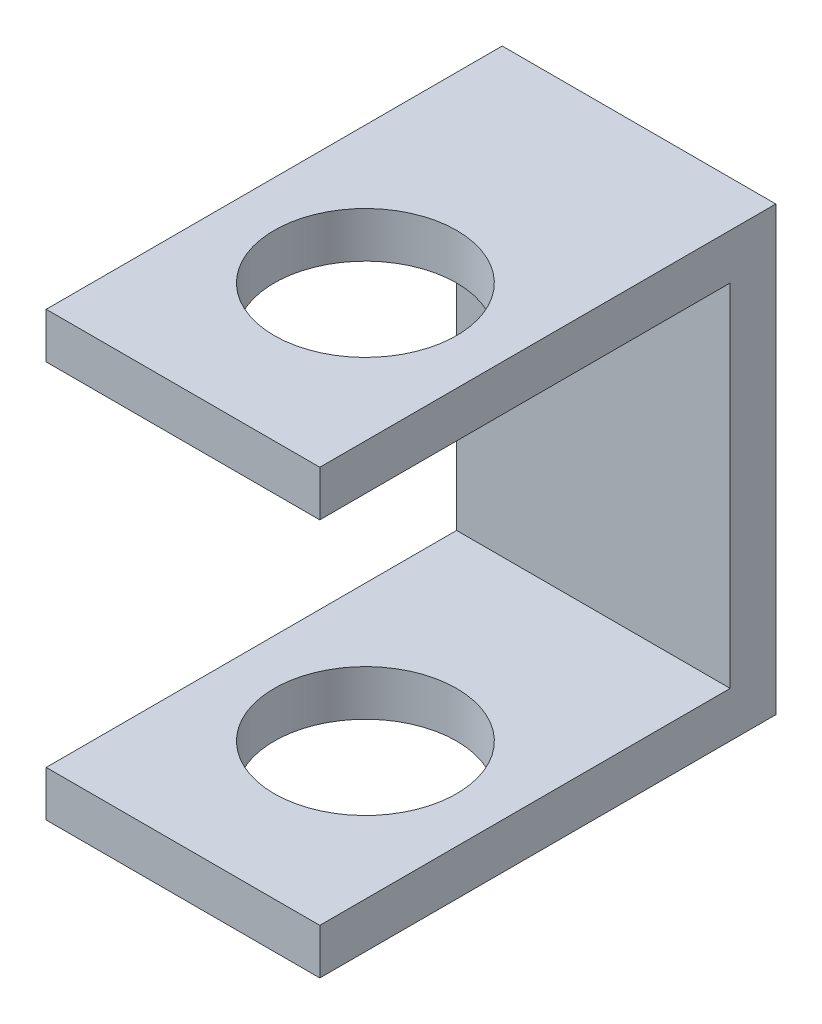
ISO-10303-21;
HEADER;
FILE_DESCRIPTION(('STEP AP214'),'2;1');
FILE_NAME('part.step','',(''),(''),'','','');
FILE_SCHEMA(('AUTOMOTIVE_DESIGN { 1 0 10303 214 1 1 1 1 }'));
ENDSEC;
DATA;
#1=APPLICATION_CONTEXT('core data for automotive mechanical design processes');
#2=APPLICATION_PROTOCOL_DEFINITION('international standard','automotive_design',2000,#1);
#3=PRODUCT_CONTEXT('',#1,'mechanical');
#4=PRODUCT('Part','Part','',(#3));
#5=PRODUCT_RELATED_PRODUCT_CATEGORY('part','',(#4));
#6=PRODUCT_DEFINITION_FORMATION('','',#4);
#7=PRODUCT_DEFINITION_CONTEXT('part definition',#1,'design');
#8=PRODUCT_DEFINITION('design','',#6,#7);
#9=PRODUCT_DEFINITION_SHAPE('','',#8);
#10=(LENGTH_UNIT() NAMED_UNIT(*) SI_UNIT(.MILLI.,.METRE.));
#11=(NAMED_UNIT(*) PLANE_ANGLE_UNIT() SI_UNIT($,.RADIAN.));
#12=(NAMED_UNIT(*) SI_UNIT($,.STERADIAN.) SOLID_ANGLE_UNIT());
#13=UNCERTAINTY_MEASURE_WITH_UNIT(LENGTH_MEASURE(1.E-05),#10,'distance_accuracy_value','');
#14=(GEOMETRIC_REPRESENTATION_CONTEXT(3) GLOBAL_UNCERTAINTY_ASSIGNED_CONTEXT((#13)) GLOBAL_UNIT_ASSIGNED_CONTEXT((#10,
#11,#12)) REPRESENTATION_CONTEXT('',''));
#15=CARTESIAN_POINT('',(0.,0.,0.));
#16=DIRECTION('',(0.,0.,1.));
#17=DIRECTION('',(1.,0.,0.));
#18=AXIS2_PLACEMENT_3D('',#15,#16,#17);
#19=CARTESIAN_POINT('',(38.1,0.,0.));
#20=DIRECTION('',(0.,0.,1.));
#21=DIRECTION('',(1.,0.,0.));
#22=AXIS2_PLACEMENT_3D('',#19,#20,#21);
#23=PLANE('',#22);
#24=DIRECTION('',(0.,1.,0.));
#25=VECTOR('',#24,1.);
#26=CARTESIAN_POINT('',(0.,0.,0.));
#27=LINE('',#26,#25);
#28=CARTESIAN_POINT('',(0.,0.,0.));
#29=VERTEX_POINT('',#28);
#30=CARTESIAN_POINT('',(0.,61.595,0.));
#31=VERTEX_POINT('',#30);
#32=EDGE_CURVE('E129',#29,#31,#27,.T.);
#33=ORIENTED_EDGE('',*,*,#32,.T.);
#34=DIRECTION('',(-1.,0.,0.));
#35=VECTOR('',#34,1.);
#36=CARTESIAN_POINT('',(38.1,61.595,0.));
#37=LINE('',#36,#35);
#38=CARTESIAN_POINT('',(38.1,61.595,0.));
#39=VERTEX_POINT('',#38);
#40=EDGE_CURVE('E11',#39,#31,#37,.T.);
#41=ORIENTED_EDGE('',*,*,#40,.F.);
#42=DIRECTION('',(0.,1.,0.));
#43=VECTOR('',#42,1.);
#44=CARTESIAN_POINT('',(38.1,0.,0.));
#45=LINE('',#44,#43);
#46=CARTESIAN_POINT('',(38.1,0.,0.));
#47=VERTEX_POINT('',#46);
#48=EDGE_CURVE('E144',#47,#39,#45,.T.);
#49=ORIENTED_EDGE('',*,*,#48,.F.);
#50=DIRECTION('',(-1.,0.,0.));
#51=VECTOR('',#50,1.);
#52=CARTESIAN_POINT('',(38.1,0.,0.));
#53=LINE('',#52,#51);
#54=EDGE_CURVE('E125',#47,#29,#53,.T.);
#55=ORIENTED_EDGE('',*,*,#54,.T.);
#56=EDGE_LOOP('',(#33,#41,#49,#55));
#57=FACE_BOUND('',#56,.T.);
#58=ADVANCED_FACE('F33',(#57),#23,.F.);
#59=CARTESIAN_POINT('',(38.1,61.595,0.));
#60=DIRECTION('',(0.,-1.,0.));
#61=DIRECTION('',(0.,0.,-1.));
#62=AXIS2_PLACEMENT_3D('',#59,#60,#61);
#63=PLANE('',#62);
#64=CARTESIAN_POINT('',(19.05,61.595,38.1));
#65=DIRECTION('',(0.,1.,0.));
#66=DIRECTION('',(0.,0.,1.));
#67=AXIS2_PLACEMENT_3D('',#64,#65,#66);
#68=CIRCLE('',#67,12.7);
#69=CARTESIAN_POINT('',(19.05,61.595,50.8));
#70=VERTEX_POINT('',#69);
#71=EDGE_CURVE('E183',#70,#70,#68,.T.);
#72=ORIENTED_EDGE('',*,*,#71,.F.);
#73=EDGE_LOOP('',(#72));
#74=FACE_BOUND('',#73,.T.);
#75=DIRECTION('',(0.,0.,1.));
#76=VECTOR('',#75,1.);
#77=CARTESIAN_POINT('',(0.,61.595,0.));
#78=LINE('',#77,#76);
#79=CARTESIAN_POINT('',(0.,61.595,63.5));
#80=VERTEX_POINT('',#79);
#81=EDGE_CURVE('E132',#31,#80,#78,.T.);
#82=ORIENTED_EDGE('',*,*,#81,.T.);
#83=DIRECTION('',(-1.,0.,0.));
#84=VECTOR('',#83,1.);
#85=CARTESIAN_POINT('',(38.1,61.595,63.5));
#86=LINE('',#85,#84);
#87=CARTESIAN_POINT('',(38.1,61.595,63.5));
#88=VERTEX_POINT('',#87);
#89=EDGE_CURVE('E41',#88,#80,#86,.T.);
#90=ORIENTED_EDGE('',*,*,#89,.F.);
#91=DIRECTION('',(0.,0.,1.));
#92=VECTOR('',#91,1.);
#93=CARTESIAN_POINT('',(38.1,61.595,0.));
#94=LINE('',#93,#92);
#95=EDGE_CURVE('E92',#39,#88,#94,.T.);
#96=ORIENTED_EDGE('',*,*,#95,.F.);
#97=ORIENTED_EDGE('',*,*,#40,.T.);
#98=EDGE_LOOP('',(#82,#90,#96,#97));
#99=FACE_BOUND('',#98,.T.);
#100=ADVANCED_FACE('F207',(#74,#99),#63,.F.);
#101=CARTESIAN_POINT('',(38.1,55.245,63.5));
#102=DIRECTION('',(0.,0.,-1.));
#103=DIRECTION('',(-1.,0.,0.));
#104=AXIS2_PLACEMENT_3D('',#101,#102,#103);
#105=PLANE('',#104);
#106=DIRECTION('',(0.,-1.,0.));
#107=VECTOR('',#106,1.);
#108=CARTESIAN_POINT('',(0.,55.245,63.5));
#109=LINE('',#108,#107);
#110=CARTESIAN_POINT('',(0.,55.245,63.5));
#111=VERTEX_POINT('',#110);
#112=EDGE_CURVE('E135',#80,#111,#109,.T.);
#113=ORIENTED_EDGE('',*,*,#112,.T.);
#114=DIRECTION('',(-1.,0.,0.));
#115=VECTOR('',#114,1.);
#116=CARTESIAN_POINT('',(38.1,55.245,63.5));
#117=LINE('',#116,#115);
#118=CARTESIAN_POINT('',(38.1,55.245,63.5));
#119=VERTEX_POINT('',#118);
#120=EDGE_CURVE('E151',#119,#111,#117,.T.);
#121=ORIENTED_EDGE('',*,*,#120,.F.);
#122=DIRECTION('',(0.,-1.,0.));
#123=VECTOR('',#122,1.);
#124=CARTESIAN_POINT('',(38.1,55.245,63.5));
#125=LINE('',#124,#123);
#126=EDGE_CURVE('E159',#88,#119,#125,.T.);
#127=ORIENTED_EDGE('',*,*,#126,.F.);
#128=ORIENTED_EDGE('',*,*,#89,.T.);
#129=EDGE_LOOP('',(#113,#121,#127,#128));
#130=FACE_BOUND('',#129,.T.);
#131=ADVANCED_FACE('F157',(#130),#105,.F.);
#132=CARTESIAN_POINT('',(38.1,55.245,63.5));
#133=DIRECTION('',(0.,1.,0.));
#134=DIRECTION('',(0.,0.,1.));
#135=AXIS2_PLACEMENT_3D('',#132,#133,#134);
#136=PLANE('',#135);
#137=CARTESIAN_POINT('',(19.05,55.245,38.1));
#138=DIRECTION('',(0.,1.,0.));
#139=DIRECTION('',(0.,0.,1.));
#140=AXIS2_PLACEMENT_3D('',#137,#138,#139);
#141=CIRCLE('',#140,12.7);
#142=CARTESIAN_POINT('',(19.05,55.245,50.8));
#143=VERTEX_POINT('',#142);
#144=EDGE_CURVE('E133',#143,#143,#141,.T.);
#145=ORIENTED_EDGE('',*,*,#144,.T.);
#146=EDGE_LOOP('',(#145));
#147=FACE_BOUND('',#146,.T.);
#148=DIRECTION('',(0.,0.,-1.));
#149=VECTOR('',#148,1.);
#150=CARTESIAN_POINT('',(0.,55.245,63.5));
#151=LINE('',#150,#149);
#152=CARTESIAN_POINT('',(0.,55.245,6.34999999999999));
#153=VERTEX_POINT('',#152);
#154=EDGE_CURVE('E137',#111,#153,#151,.T.);
#155=ORIENTED_EDGE('',*,*,#154,.T.);
#156=DIRECTION('',(-1.,0.,0.));
#157=VECTOR('',#156,1.);
#158=CARTESIAN_POINT('',(38.1,55.245,6.34999999999999));
#159=LINE('',#158,#157);
#160=CARTESIAN_POINT('',(38.1,55.245,6.34999999999999));
#161=VERTEX_POINT('',#160);
#162=EDGE_CURVE('E148',#161,#153,#159,.T.);
#163=ORIENTED_EDGE('',*,*,#162,.F.);
#164=DIRECTION('',(0.,0.,-1.));
#165=VECTOR('',#164,1.);
#166=CARTESIAN_POINT('',(38.1,55.245,63.5));
#167=LINE('',#166,#165);
#168=EDGE_CURVE('E171',#119,#161,#167,.T.);
#169=ORIENTED_EDGE('',*,*,#168,.F.);
#170=ORIENTED_EDGE('',*,*,#120,.T.);
#171=EDGE_LOOP('',(#155,#163,#169,#170));
#172=FACE_BOUND('',#171,.T.);
#173=ADVANCED_FACE('F167',(#147,#172),#136,.F.);
#174=CARTESIAN_POINT('',(38.1,55.245,6.34999999999999));
#175=DIRECTION('',(0.,0.,-1.));
#176=DIRECTION('',(-1.,0.,0.));
#177=AXIS2_PLACEMENT_3D('',#174,#175,#176);
#178=PLANE('',#177);
#179=DIRECTION('',(0.,-1.,0.));
#180=VECTOR('',#179,1.);
#181=CARTESIAN_POINT('',(0.,55.245,6.34999999999999));
#182=LINE('',#181,#180);
#183=CARTESIAN_POINT('',(0.,6.34999999999998,6.34999999999999));
#184=VERTEX_POINT('',#183);
#185=EDGE_CURVE('E139',#153,#184,#182,.T.);
#186=ORIENTED_EDGE('',*,*,#185,.T.);
#187=DIRECTION('',(-1.,0.,0.));
#188=VECTOR('',#187,1.);
#189=CARTESIAN_POINT('',(38.1,6.34999999999998,6.34999999999999));
#190=LINE('',#189,#188);
#191=CARTESIAN_POINT('',(38.1,6.34999999999998,6.34999999999999));
#192=VERTEX_POINT('',#191);
#193=EDGE_CURVE('E120',#192,#184,#190,.T.);
#194=ORIENTED_EDGE('',*,*,#193,.F.);
#195=DIRECTION('',(0.,-1.,0.));
#196=VECTOR('',#195,1.);
#197=CARTESIAN_POINT('',(38.1,55.245,6.34999999999999));
#198=LINE('',#197,#196);
#199=EDGE_CURVE('E111',#161,#192,#198,.T.);
#200=ORIENTED_EDGE('',*,*,#199,.F.);
#201=ORIENTED_EDGE('',*,*,#162,.T.);
#202=EDGE_LOOP('',(#186,#194,#200,#201));
#203=FACE_BOUND('',#202,.T.);
#204=ADVANCED_FACE('F170',(#203),#178,.F.);
#205=CARTESIAN_POINT('',(38.1,6.34999999999998,6.34999999999999));
#206=DIRECTION('',(0.,-1.,0.));
#207=DIRECTION('',(0.,0.,-1.));
#208=AXIS2_PLACEMENT_3D('',#205,#206,#207);
#209=PLANE('',#208);
#210=CARTESIAN_POINT('',(19.05,6.34999999999998,38.1));
#211=DIRECTION('',(0.,-1.,0.));
#212=DIRECTION('',(0.,0.,-1.));
#213=AXIS2_PLACEMENT_3D('',#210,#211,#212);
#214=CIRCLE('',#213,12.7);
#215=CARTESIAN_POINT('',(19.05,6.34999999999998,25.4));
#216=VERTEX_POINT('',#215);
#217=EDGE_CURVE('E179',#216,#216,#214,.T.);
#218=ORIENTED_EDGE('',*,*,#217,.T.);
#219=EDGE_LOOP('',(#218));
#220=FACE_BOUND('',#219,.T.);
#221=DIRECTION('',(0.,0.,1.));
#222=VECTOR('',#221,1.);
#223=CARTESIAN_POINT('',(0.,6.34999999999998,6.34999999999999));
#224=LINE('',#223,#222);
#225=CARTESIAN_POINT('',(0.,6.34999999999998,63.5));
#226=VERTEX_POINT('',#225);
#227=EDGE_CURVE('E119',#184,#226,#224,.T.);
#228=ORIENTED_EDGE('',*,*,#227,.T.);
#229=DIRECTION('',(-1.,0.,0.));
#230=VECTOR('',#229,1.);
#231=CARTESIAN_POINT('',(38.1,6.34999999999998,63.5));
#232=LINE('',#231,#230);
#233=CARTESIAN_POINT('',(38.1,6.34999999999998,63.5));
#234=VERTEX_POINT('',#233);
#235=EDGE_CURVE('E116',#234,#226,#232,.T.);
#236=ORIENTED_EDGE('',*,*,#235,.F.);
#237=DIRECTION('',(0.,0.,1.));
#238=VECTOR('',#237,1.);
#239=CARTESIAN_POINT('',(38.1,6.34999999999998,6.34999999999999));
#240=LINE('',#239,#238);
#241=EDGE_CURVE('E105',#192,#234,#240,.T.);
#242=ORIENTED_EDGE('',*,*,#241,.F.);
#243=ORIENTED_EDGE('',*,*,#193,.T.);
#244=EDGE_LOOP('',(#228,#236,#242,#243));
#245=FACE_BOUND('',#244,.T.);
#246=ADVANCED_FACE('F117',(#220,#245),#209,.F.);
#247=CARTESIAN_POINT('',(38.1,0.,63.5));
#248=DIRECTION('',(0.,0.,-1.));
#249=DIRECTION('',(-1.,0.,0.));
#250=AXIS2_PLACEMENT_3D('',#247,#248,#249);
#251=PLANE('',#250);
#252=DIRECTION('',(0.,-1.,0.));
#253=VECTOR('',#252,1.);
#254=CARTESIAN_POINT('',(0.,0.,63.5));
#255=LINE('',#254,#253);
#256=CARTESIAN_POINT('',(0.,0.,63.5));
#257=VERTEX_POINT('',#256);
#258=EDGE_CURVE('E78',#226,#257,#255,.T.);
#259=ORIENTED_EDGE('',*,*,#258,.T.);
#260=DIRECTION('',(-1.,0.,0.));
#261=VECTOR('',#260,1.);
#262=CARTESIAN_POINT('',(38.1,0.,63.5));
#263=LINE('',#262,#261);
#264=CARTESIAN_POINT('',(38.1,0.,63.5));
#265=VERTEX_POINT('',#264);
#266=EDGE_CURVE('E121',#265,#257,#263,.T.);
#267=ORIENTED_EDGE('',*,*,#266,.F.);
#268=DIRECTION('',(0.,-1.,0.));
#269=VECTOR('',#268,1.);
#270=CARTESIAN_POINT('',(38.1,0.,63.5));
#271=LINE('',#270,#269);
#272=EDGE_CURVE('E109',#234,#265,#271,.T.);
#273=ORIENTED_EDGE('',*,*,#272,.F.);
#274=ORIENTED_EDGE('',*,*,#235,.T.);
#275=EDGE_LOOP('',(#259,#267,#273,#274));
#276=FACE_BOUND('',#275,.T.);
#277=ADVANCED_FACE('F123',(#276),#251,.F.);
#278=CARTESIAN_POINT('',(38.1,0.,0.));
#279=DIRECTION('',(0.,1.,0.));
#280=DIRECTION('',(0.,0.,1.));
#281=AXIS2_PLACEMENT_3D('',#278,#279,#280);
#282=PLANE('',#281);
#283=CARTESIAN_POINT('',(19.05,0.,38.1));
#284=DIRECTION('',(0.,1.,0.));
#285=DIRECTION('',(0.,0.,1.));
#286=AXIS2_PLACEMENT_3D('',#283,#284,#285);
#287=CIRCLE('',#286,12.7);
#288=CARTESIAN_POINT('',(19.05,0.,50.8));
#289=VERTEX_POINT('',#288);
#290=EDGE_CURVE('E182',#289,#289,#287,.T.);
#291=ORIENTED_EDGE('',*,*,#290,.T.);
#292=EDGE_LOOP('',(#291));
#293=FACE_BOUND('',#292,.T.);
#294=DIRECTION('',(0.,0.,-1.));
#295=VECTOR('',#294,1.);
#296=CARTESIAN_POINT('',(0.,0.,0.));
#297=LINE('',#296,#295);
#298=EDGE_CURVE('E84',#257,#29,#297,.T.);
#299=ORIENTED_EDGE('',*,*,#298,.T.);
#300=ORIENTED_EDGE('',*,*,#54,.F.);
#301=DIRECTION('',(0.,0.,-1.));
#302=VECTOR('',#301,1.);
#303=CARTESIAN_POINT('',(38.1,0.,0.));
#304=LINE('',#303,#302);
#305=EDGE_CURVE('E49',#265,#47,#304,.T.);
#306=ORIENTED_EDGE('',*,*,#305,.F.);
#307=ORIENTED_EDGE('',*,*,#266,.T.);
#308=EDGE_LOOP('',(#299,#300,#306,#307));
#309=FACE_BOUND('',#308,.T.);
#310=ADVANCED_FACE('F189',(#293,#309),#282,.F.);
#311=CARTESIAN_POINT('',(38.1,0.,0.));
#312=DIRECTION('',(1.,0.,0.));
#313=DIRECTION('',(0.,0.,-1.));
#314=AXIS2_PLACEMENT_3D('',#311,#312,#313);
#315=PLANE('',#314);
#316=ORIENTED_EDGE('',*,*,#48,.T.);
#317=ORIENTED_EDGE('',*,*,#95,.T.);
#318=ORIENTED_EDGE('',*,*,#126,.T.);
#319=ORIENTED_EDGE('',*,*,#168,.T.);
#320=ORIENTED_EDGE('',*,*,#199,.T.);
#321=ORIENTED_EDGE('',*,*,#241,.T.);
#322=ORIENTED_EDGE('',*,*,#272,.T.);
#323=ORIENTED_EDGE('',*,*,#305,.T.);
#324=EDGE_LOOP('',(#316,#317,#318,#319,#320,#321,#322,#323));
#325=FACE_BOUND('',#324,.T.);
#326=ADVANCED_FACE('F107',(#325),#315,.T.);
#327=CARTESIAN_POINT('',(0.,0.,0.));
#328=DIRECTION('',(1.,0.,0.));
#329=DIRECTION('',(0.,0.,-1.));
#330=AXIS2_PLACEMENT_3D('',#327,#328,#329);
#331=PLANE('',#330);
#332=ORIENTED_EDGE('',*,*,#32,.F.);
#333=ORIENTED_EDGE('',*,*,#298,.F.);
#334=ORIENTED_EDGE('',*,*,#258,.F.);
#335=ORIENTED_EDGE('',*,*,#227,.F.);
#336=ORIENTED_EDGE('',*,*,#185,.F.);
#337=ORIENTED_EDGE('',*,*,#154,.F.);
#338=ORIENTED_EDGE('',*,*,#112,.F.);
#339=ORIENTED_EDGE('',*,*,#81,.F.);
#340=EDGE_LOOP('',(#332,#333,#334,#335,#336,#337,#338,#339));
#341=FACE_BOUND('',#340,.T.);
#342=ADVANCED_FACE('F163',(#341),#331,.F.);
#343=CARTESIAN_POINT('',(19.05,0.,38.1));
#344=DIRECTION('',(0.,1.,0.));
#345=DIRECTION('',(0.,0.,1.));
#346=AXIS2_PLACEMENT_3D('',#343,#344,#345);
#347=CYLINDRICAL_SURFACE('',#346,12.7);
#348=ORIENTED_EDGE('',*,*,#290,.F.);
#349=EDGE_LOOP('',(#348));
#350=FACE_BOUND('',#349,.T.);
#351=ORIENTED_EDGE('',*,*,#217,.F.);
#352=EDGE_LOOP('',(#351));
#353=FACE_BOUND('',#352,.T.);
#354=ADVANCED_FACE('F191',(#350,#353),#347,.F.);
#355=ORIENTED_EDGE('',*,*,#71,.T.);
#356=EDGE_LOOP('',(#355));
#357=FACE_BOUND('',#356,.T.);
#358=ORIENTED_EDGE('',*,*,#144,.F.);
#359=EDGE_LOOP('',(#358));
#360=FACE_BOUND('',#359,.T.);
#361=ADVANCED_FACE('F194',(#357,#360),#347,.F.);
#362=CLOSED_SHELL('',(#58,#100,#131,#173,#204,#246,#277,#310,#326,#342,#354,#361));
#363=MANIFOLD_SOLID_BREP('B2',#362);
#364=ADVANCED_BREP_SHAPE_REPRESENTATION('',(#18,#363),#14);
#365=SHAPE_DEFINITION_REPRESENTATION(#9,#364);
ENDSEC;
END-ISO-10303-21;
